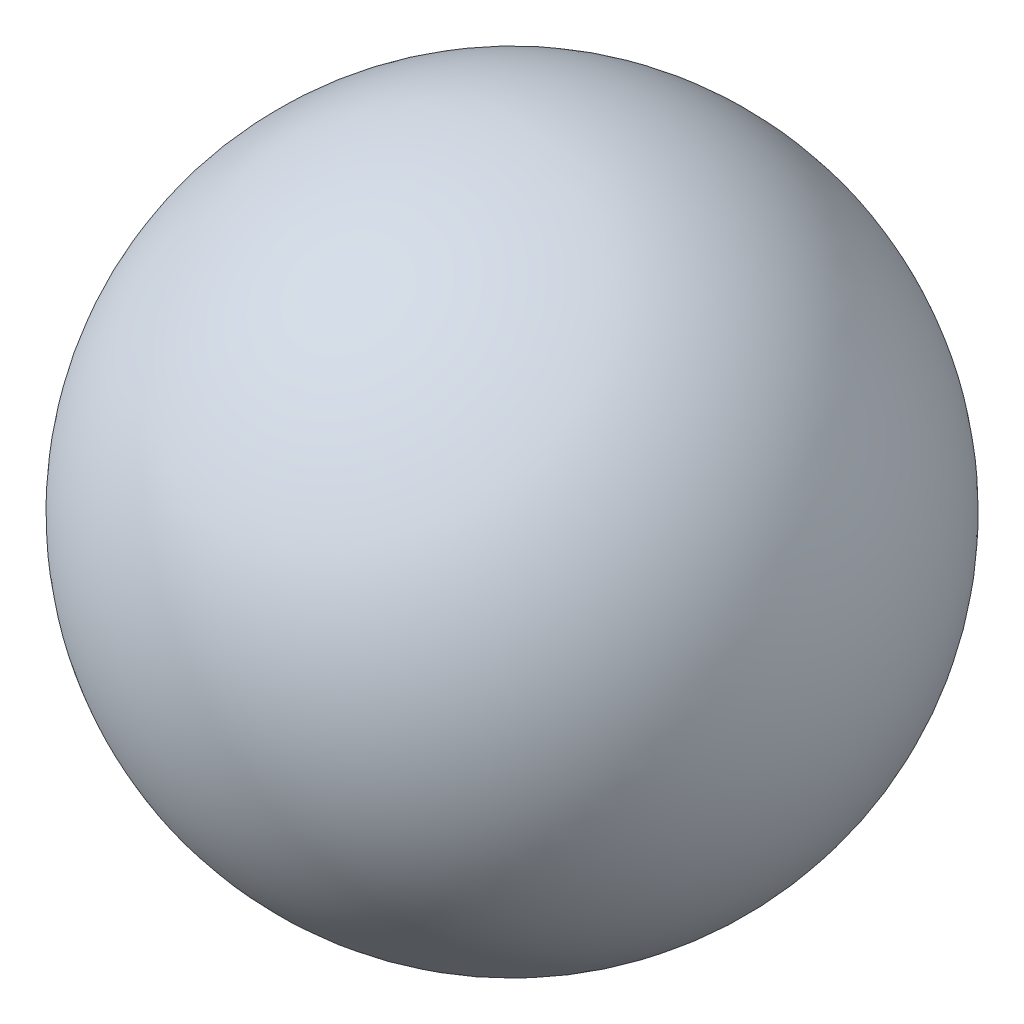
ISO-10303-21;
HEADER;
FILE_DESCRIPTION(('STEP AP214'),'2;1');
FILE_NAME('part.step','',(''),(''),'','','');
FILE_SCHEMA(('AUTOMOTIVE_DESIGN { 1 0 10303 214 1 1 1 1 }'));
ENDSEC;
DATA;
#1=APPLICATION_CONTEXT('core data for automotive mechanical design processes');
#2=APPLICATION_PROTOCOL_DEFINITION('international standard','automotive_design',2000,#1);
#3=PRODUCT_CONTEXT('',#1,'mechanical');
#4=PRODUCT('Part','Part','',(#3));
#5=PRODUCT_RELATED_PRODUCT_CATEGORY('part','',(#4));
#6=PRODUCT_DEFINITION_FORMATION('','',#4);
#7=PRODUCT_DEFINITION_CONTEXT('part definition',#1,'design');
#8=PRODUCT_DEFINITION('design','',#6,#7);
#9=PRODUCT_DEFINITION_SHAPE('','',#8);
#10=(LENGTH_UNIT() NAMED_UNIT(*) SI_UNIT(.MILLI.,.METRE.));
#11=(NAMED_UNIT(*) PLANE_ANGLE_UNIT() SI_UNIT($,.RADIAN.));
#12=(NAMED_UNIT(*) SI_UNIT($,.STERADIAN.) SOLID_ANGLE_UNIT());
#13=UNCERTAINTY_MEASURE_WITH_UNIT(LENGTH_MEASURE(1.E-05),#10,'distance_accuracy_value','');
#14=(GEOMETRIC_REPRESENTATION_CONTEXT(3) GLOBAL_UNCERTAINTY_ASSIGNED_CONTEXT((#13)) GLOBAL_UNIT_ASSIGNED_CONTEXT((#10,
#11,#12)) REPRESENTATION_CONTEXT('',''));
#15=CARTESIAN_POINT('',(0.,0.,0.));
#16=DIRECTION('',(0.,0.,1.));
#17=DIRECTION('',(1.,0.,0.));
#18=AXIS2_PLACEMENT_3D('',#15,#16,#17);
#19=CARTESIAN_POINT('',(0.,0.,0.));
#20=DIRECTION('',(0.,0.,1.));
#21=DIRECTION('',(-1.,0.,0.));
#22=AXIS2_PLACEMENT_3D('',#19,#20,#21);
#23=SPHERICAL_SURFACE('',#22,21.335);
#24=CARTESIAN_POINT('',(0.,0.,21.335));
#25=VERTEX_POINT('',#24);
#26=VERTEX_LOOP('',#25);
#27=FACE_BOUND('',#26,.T.);
#28=ADVANCED_FACE('F41',(#27),#23,.T.);
#29=CLOSED_SHELL('',(#28));
#30=MANIFOLD_SOLID_BREP('B2',#29);
#31=ADVANCED_BREP_SHAPE_REPRESENTATION('',(#18,#30),#14);
#32=SHAPE_DEFINITION_REPRESENTATION(#9,#31);
ENDSEC;
END-ISO-10303-21;
